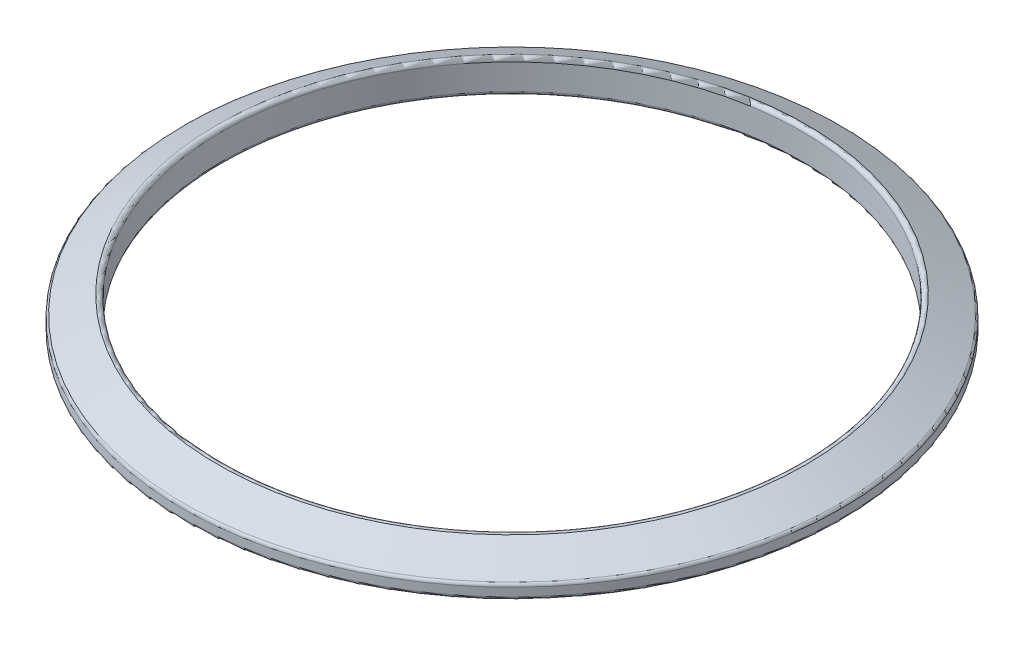
ISO-10303-21;
HEADER;
FILE_DESCRIPTION(('STEP AP214'),'2;1');
FILE_NAME('part.step','',(''),(''),'','','');
FILE_SCHEMA(('AUTOMOTIVE_DESIGN { 1 0 10303 214 1 1 1 1 }'));
ENDSEC;
DATA;
#1=APPLICATION_CONTEXT('core data for automotive mechanical design processes');
#2=APPLICATION_PROTOCOL_DEFINITION('international standard','automotive_design',2000,#1);
#3=PRODUCT_CONTEXT('',#1,'mechanical');
#4=PRODUCT('Part','Part','',(#3));
#5=PRODUCT_RELATED_PRODUCT_CATEGORY('part','',(#4));
#6=PRODUCT_DEFINITION_FORMATION('','',#4);
#7=PRODUCT_DEFINITION_CONTEXT('part definition',#1,'design');
#8=PRODUCT_DEFINITION('design','',#6,#7);
#9=PRODUCT_DEFINITION_SHAPE('','',#8);
#10=(LENGTH_UNIT() NAMED_UNIT(*) SI_UNIT(.MILLI.,.METRE.));
#11=(NAMED_UNIT(*) PLANE_ANGLE_UNIT() SI_UNIT($,.RADIAN.));
#12=(NAMED_UNIT(*) SI_UNIT($,.STERADIAN.) SOLID_ANGLE_UNIT());
#13=UNCERTAINTY_MEASURE_WITH_UNIT(LENGTH_MEASURE(1.E-05),#10,'distance_accuracy_value','');
#14=(GEOMETRIC_REPRESENTATION_CONTEXT(3) GLOBAL_UNCERTAINTY_ASSIGNED_CONTEXT((#13)) GLOBAL_UNIT_ASSIGNED_CONTEXT((#10,
#11,#12)) REPRESENTATION_CONTEXT('',''));
#15=CARTESIAN_POINT('',(0.,0.,0.));
#16=DIRECTION('',(0.,0.,1.));
#17=DIRECTION('',(1.,0.,0.));
#18=AXIS2_PLACEMENT_3D('',#15,#16,#17);
#19=CARTESIAN_POINT('',(0.,0.5,0.));
#20=DIRECTION('',(0.,1.,0.));
#21=DIRECTION('',(-0.999987705296869,0.,-0.00495875539848985));
#22=AXIS2_PLACEMENT_3D('',#19,#20,#21);
#23=TOROIDAL_SURFACE('',#22,41.75,0.5);
#24=CARTESIAN_POINT('',(0.,0.,0.));
#25=DIRECTION('',(0.,1.,0.));
#26=DIRECTION('',(-1.,0.,0.));
#27=AXIS2_PLACEMENT_3D('',#24,#25,#26);
#28=CIRCLE('',#27,41.74999998856);
#29=CARTESIAN_POINT('',(41.7494866847044,0.,0.207028037830218));
#30=VERTEX_POINT('',#29);
#31=EDGE_CURVE('E111',#30,#30,#28,.T.);
#32=ORIENTED_EDGE('',*,*,#31,.F.);
#33=CARTESIAN_POINT('',(41.7494866961443,0.5,0.207028037886946));
#34=DIRECTION('',(0.00495875539848973,0.,-0.999987705296869));
#35=DIRECTION('',(0.999987705296869,0.,0.00495875539848973));
#36=AXIS2_PLACEMENT_3D('',#33,#34,#35);
#37=CIRCLE('',#36,0.5);
#38=CARTESIAN_POINT('',(41.2494928434958,0.5,0.204548660187701));
#39=VERTEX_POINT('',#38);
#40=EDGE_CURVE('E11',#30,#39,#37,.T.);
#41=ORIENTED_EDGE('',*,*,#40,.T.);
#42=CARTESIAN_POINT('',(0.,0.5,0.));
#43=DIRECTION('',(0.,1.,0.));
#44=DIRECTION('',(1.,0.,0.));
#45=AXIS2_PLACEMENT_3D('',#42,#43,#44);
#46=CIRCLE('',#45,41.25);
#47=CARTESIAN_POINT('',(-41.25,0.5,0.));
#48=VERTEX_POINT('',#47);
#49=EDGE_CURVE('E145',#39,#48,#46,.T.);
#50=ORIENTED_EDGE('',*,*,#49,.T.);
#51=CARTESIAN_POINT('',(0.,0.5,0.));
#52=DIRECTION('',(0.,1.,0.));
#53=DIRECTION('',(1.,0.,0.));
#54=AXIS2_PLACEMENT_3D('',#51,#52,#53);
#55=CIRCLE('',#54,41.25);
#56=EDGE_CURVE('E149',#48,#39,#55,.T.);
#57=ORIENTED_EDGE('',*,*,#56,.T.);
#58=ORIENTED_EDGE('',*,*,#40,.F.);
#59=EDGE_LOOP('',(#32,#41,#50,#57,#58));
#60=FACE_BOUND('',#59,.T.);
#61=ADVANCED_FACE('F17',(#60),#23,.T.);
#62=CARTESIAN_POINT('',(0.,-0.25,0.));
#63=DIRECTION('',(0.,1.,0.));
#64=DIRECTION('',(1.,0.,0.));
#65=AXIS2_PLACEMENT_3D('',#62,#63,#64);
#66=CYLINDRICAL_SURFACE('',#65,41.25);
#67=ORIENTED_EDGE('',*,*,#49,.F.);
#68=ORIENTED_EDGE('',*,*,#56,.F.);
#69=DIRECTION('',(0.,1.,0.));
#70=VECTOR('',#69,1.);
#71=CARTESIAN_POINT('',(-41.25,-0.25,0.));
#72=LINE('',#71,#70);
#73=CARTESIAN_POINT('',(-41.25,4.175168618649,0.));
#74=VERTEX_POINT('',#73);
#75=EDGE_CURVE('E28',#48,#74,#72,.T.);
#76=ORIENTED_EDGE('',*,*,#75,.T.);
#77=CARTESIAN_POINT('',(0.,4.175168618649,0.));
#78=DIRECTION('',(0.,1.,0.));
#79=DIRECTION('',(1.,0.,0.));
#80=AXIS2_PLACEMENT_3D('',#77,#78,#79);
#81=CIRCLE('',#80,41.25);
#82=CARTESIAN_POINT('',(-41.2495567787434,4.175168618649,-0.191221225882323));
#83=VERTEX_POINT('',#82);
#84=EDGE_CURVE('E129',#74,#83,#81,.T.);
#85=ORIENTED_EDGE('',*,*,#84,.T.);
#86=CARTESIAN_POINT('',(0.,4.175168618649,0.));
#87=DIRECTION('',(0.,1.,0.));
#88=DIRECTION('',(1.,0.,0.));
#89=AXIS2_PLACEMENT_3D('',#86,#87,#88);
#90=CIRCLE('',#89,41.25);
#91=EDGE_CURVE('E126',#83,#74,#90,.T.);
#92=ORIENTED_EDGE('',*,*,#91,.T.);
#93=ORIENTED_EDGE('',*,*,#75,.F.);
#94=EDGE_LOOP('',(#67,#68,#76,#85,#92,#93));
#95=FACE_BOUND('',#94,.T.);
#96=ADVANCED_FACE('F196',(#95),#66,.F.);
#97=CARTESIAN_POINT('',(0.,4.175168618649,0.));
#98=DIRECTION('',(0.,1.,0.));
#99=DIRECTION('',(0.999989255242263,0.,0.00463566608199583));
#100=AXIS2_PLACEMENT_3D('',#97,#98,#99);
#101=TOROIDAL_SURFACE('',#100,41.75,0.5);
#102=ORIENTED_EDGE('',*,*,#84,.F.);
#103=ORIENTED_EDGE('',*,*,#91,.F.);
#104=CARTESIAN_POINT('',(-41.7495514063645,4.175168618649,-0.193539058923321));
#105=DIRECTION('',(-0.00463566608199571,0.,0.999989255242263));
#106=DIRECTION('',(-0.999989255242263,0.,-0.00463566608199571));
#107=AXIS2_PLACEMENT_3D('',#104,#105,#106);
#108=CIRCLE('',#107,0.5);
#109=CARTESIAN_POINT('',(-41.9808319697842,4.618461018172,-0.194611209906593));
#110=VERTEX_POINT('',#109);
#111=EDGE_CURVE('E21',#83,#110,#108,.T.);
#112=ORIENTED_EDGE('',*,*,#111,.T.);
#113=CARTESIAN_POINT('',(0.,4.618461018172,0.));
#114=DIRECTION('',(0.,1.,0.));
#115=DIRECTION('',(1.,0.,0.));
#116=AXIS2_PLACEMENT_3D('',#113,#114,#115);
#117=CIRCLE('',#116,41.9812830485);
#118=CARTESIAN_POINT('',(41.9812830485014,4.61846101817462,0.));
#119=VERTEX_POINT('',#118);
#120=EDGE_CURVE('E136',#110,#119,#117,.T.);
#121=ORIENTED_EDGE('',*,*,#120,.T.);
#122=CARTESIAN_POINT('',(0.,4.618461018172,0.));
#123=DIRECTION('',(0.,1.,0.));
#124=DIRECTION('',(1.,0.,0.));
#125=AXIS2_PLACEMENT_3D('',#122,#123,#124);
#126=CIRCLE('',#125,41.9812830485);
#127=EDGE_CURVE('E140',#119,#110,#126,.T.);
#128=ORIENTED_EDGE('',*,*,#127,.T.);
#129=ORIENTED_EDGE('',*,*,#111,.F.);
#130=EDGE_LOOP('',(#102,#103,#112,#121,#128,#129));
#131=FACE_BOUND('',#130,.T.);
#132=ADVANCED_FACE('F172',(#131),#101,.T.);
#133=CARTESIAN_POINT('',(0.,3.37933043513,0.));
#134=DIRECTION('',(0.,-1.,0.));
#135=DIRECTION('',(-1.,0.,0.));
#136=AXIS2_PLACEMENT_3D('',#133,#134,#135);
#137=CONICAL_SURFACE('',#136,44.35628333267,1.08990904659952);
#138=CARTESIAN_POINT('',(0.,2.140200142059,0.));
#139=DIRECTION('',(0.,1.,0.));
#140=DIRECTION('',(1.,0.,0.));
#141=AXIS2_PLACEMENT_3D('',#138,#139,#140);
#142=CIRCLE('',#141,46.73128306105);
#143=CARTESIAN_POINT('',(-46.7308404949482,2.140200142059,-0.203379368891428));
#144=VERTEX_POINT('',#143);
#145=CARTESIAN_POINT('',(46.7312830610513,2.1402001420614,0.));
#146=VERTEX_POINT('',#145);
#147=EDGE_CURVE('E125',#144,#146,#142,.T.);
#148=ORIENTED_EDGE('',*,*,#147,.T.);
#149=DIRECTION('',(-0.886584846165437,0.462566006695054,0.));
#150=VECTOR('',#149,1.);
#151=CARTESIAN_POINT('',(44.35628333267,3.37933043513,0.));
#152=LINE('',#151,#150);
#153=EDGE_CURVE('E141',#146,#119,#152,.T.);
#154=ORIENTED_EDGE('',*,*,#153,.T.);
#155=ORIENTED_EDGE('',*,*,#120,.F.);
#156=ORIENTED_EDGE('',*,*,#127,.F.);
#157=ORIENTED_EDGE('',*,*,#153,.F.);
#158=CARTESIAN_POINT('',(0.,2.140200142059,0.));
#159=DIRECTION('',(0.,1.,0.));
#160=DIRECTION('',(1.,0.,0.));
#161=AXIS2_PLACEMENT_3D('',#158,#159,#160);
#162=CIRCLE('',#161,46.73128306105);
#163=EDGE_CURVE('E135',#146,#144,#162,.T.);
#164=ORIENTED_EDGE('',*,*,#163,.T.);
#165=EDGE_LOOP('',(#148,#154,#155,#156,#157,#164));
#166=FACE_BOUND('',#165,.T.);
#167=ADVANCED_FACE('F175',(#166),#137,.T.);
#168=CARTESIAN_POINT('',(0.,1.696907749084,0.));
#169=DIRECTION('',(0.,1.,0.));
#170=DIRECTION('',(0.999990529553806,0.,0.00435210325010203));
#171=AXIS2_PLACEMENT_3D('',#168,#169,#170);
#172=TOROIDAL_SURFACE('',#171,46.5,0.5);
#173=ORIENTED_EDGE('',*,*,#147,.F.);
#174=CARTESIAN_POINT('',(-46.499559624252,1.696907749084,-0.202372801129738));
#175=DIRECTION('',(-0.0043521032501019,0.,0.999990529553806));
#176=DIRECTION('',(-0.999990529553806,0.,-0.0043521032501019));
#177=AXIS2_PLACEMENT_3D('',#174,#175,#176);
#178=CIRCLE('',#177,0.5);
#179=CARTESIAN_POINT('',(-46.9995548890289,1.696907749118,-0.204548852754789));
#180=VERTEX_POINT('',#179);
#181=EDGE_CURVE('E132',#144,#180,#178,.T.);
#182=ORIENTED_EDGE('',*,*,#181,.T.);
#183=CARTESIAN_POINT('',(0.,1.696907749118,0.));
#184=DIRECTION('',(0.,1.,0.));
#185=DIRECTION('',(1.,0.,0.));
#186=AXIS2_PLACEMENT_3D('',#183,#184,#185);
#187=CIRCLE('',#186,47.);
#188=CARTESIAN_POINT('',(-47.,1.696907749118,0.));
#189=VERTEX_POINT('',#188);
#190=EDGE_CURVE('E99',#180,#189,#187,.T.);
#191=ORIENTED_EDGE('',*,*,#190,.T.);
#192=CARTESIAN_POINT('',(0.,1.696907749118,0.));
#193=DIRECTION('',(0.,1.,0.));
#194=DIRECTION('',(1.,0.,0.));
#195=AXIS2_PLACEMENT_3D('',#192,#193,#194);
#196=CIRCLE('',#195,47.);
#197=EDGE_CURVE('E97',#189,#180,#196,.T.);
#198=ORIENTED_EDGE('',*,*,#197,.T.);
#199=ORIENTED_EDGE('',*,*,#181,.F.);
#200=ORIENTED_EDGE('',*,*,#163,.F.);
#201=EDGE_LOOP('',(#173,#182,#191,#198,#199,#200));
#202=FACE_BOUND('',#201,.T.);
#203=ADVANCED_FACE('F19',(#202),#172,.T.);
#204=CARTESIAN_POINT('',(0.,-0.25,0.));
#205=DIRECTION('',(0.,1.,0.));
#206=DIRECTION('',(1.,0.,0.));
#207=AXIS2_PLACEMENT_3D('',#204,#205,#206);
#208=CYLINDRICAL_SURFACE('',#207,47.);
#209=ORIENTED_EDGE('',*,*,#197,.F.);
#210=DIRECTION('',(0.,-1.,0.));
#211=VECTOR('',#210,1.);
#212=CARTESIAN_POINT('',(-47.,-0.25,0.));
#213=LINE('',#212,#211);
#214=CARTESIAN_POINT('',(-47.,0.5,0.));
#215=VERTEX_POINT('',#214);
#216=EDGE_CURVE('E90',#189,#215,#213,.T.);
#217=ORIENTED_EDGE('',*,*,#216,.T.);
#218=CARTESIAN_POINT('',(0.,0.5,0.));
#219=DIRECTION('',(0.,1.,0.));
#220=DIRECTION('',(1.,0.,0.));
#221=AXIS2_PLACEMENT_3D('',#218,#219,#220);
#222=CIRCLE('',#221,47.);
#223=CARTESIAN_POINT('',(-46.9995109197132,0.5,-0.214413870252865));
#224=VERTEX_POINT('',#223);
#225=EDGE_CURVE('E94',#215,#224,#222,.T.);
#226=ORIENTED_EDGE('',*,*,#225,.T.);
#227=CARTESIAN_POINT('',(0.,0.5,0.));
#228=DIRECTION('',(0.,1.,0.));
#229=DIRECTION('',(1.,0.,0.));
#230=AXIS2_PLACEMENT_3D('',#227,#228,#229);
#231=CIRCLE('',#230,47.);
#232=EDGE_CURVE('E102',#224,#215,#231,.T.);
#233=ORIENTED_EDGE('',*,*,#232,.T.);
#234=ORIENTED_EDGE('',*,*,#216,.F.);
#235=ORIENTED_EDGE('',*,*,#190,.F.);
#236=EDGE_LOOP('',(#209,#217,#226,#233,#234,#235));
#237=FACE_BOUND('',#236,.T.);
#238=ADVANCED_FACE('F92',(#237),#208,.T.);
#239=CARTESIAN_POINT('',(0.,0.5,0.));
#240=DIRECTION('',(0.,1.,0.));
#241=DIRECTION('',(0.999989594036452,0.,0.00456199723942278));
#242=AXIS2_PLACEMENT_3D('',#239,#240,#241);
#243=TOROIDAL_SURFACE('',#242,46.5,0.5);
#244=ORIENTED_EDGE('',*,*,#225,.F.);
#245=ORIENTED_EDGE('',*,*,#232,.F.);
#246=CARTESIAN_POINT('',(-46.499516122695,0.5,-0.212132871633154));
#247=DIRECTION('',(-0.00456199723942266,0.,0.999989594036452));
#248=DIRECTION('',(-0.999989594036452,0.,-0.00456199723942266));
#249=AXIS2_PLACEMENT_3D('',#246,#247,#248);
#250=CIRCLE('',#249,0.5);
#251=CARTESIAN_POINT('',(-46.4995162053141,0.,-0.212132872010066));
#252=VERTEX_POINT('',#251);
#253=EDGE_CURVE('E106',#224,#252,#250,.T.);
#254=ORIENTED_EDGE('',*,*,#253,.T.);
#255=CARTESIAN_POINT('',(0.,0.,0.));
#256=DIRECTION('',(0.,1.,0.));
#257=DIRECTION('',(1.,0.,0.));
#258=AXIS2_PLACEMENT_3D('',#255,#256,#257);
#259=CIRCLE('',#258,46.50000008262);
#260=EDGE_CURVE('E118',#252,#252,#259,.T.);
#261=ORIENTED_EDGE('',*,*,#260,.T.);
#262=ORIENTED_EDGE('',*,*,#253,.F.);
#263=EDGE_LOOP('',(#244,#245,#254,#261,#262));
#264=FACE_BOUND('',#263,.T.);
#265=ADVANCED_FACE('F108',(#264),#243,.T.);
#266=CARTESIAN_POINT('',(0.,0.,0.));
#267=DIRECTION('',(0.,1.,0.));
#268=DIRECTION('',(1.,0.,0.));
#269=AXIS2_PLACEMENT_3D('',#266,#267,#268);
#270=PLANE('',#269);
#271=ORIENTED_EDGE('',*,*,#31,.T.);
#272=EDGE_LOOP('',(#271));
#273=FACE_BOUND('',#272,.T.);
#274=ORIENTED_EDGE('',*,*,#260,.F.);
#275=EDGE_LOOP('',(#274));
#276=FACE_BOUND('',#275,.T.);
#277=ADVANCED_FACE('F200',(#273,#276),#270,.F.);
#278=CLOSED_SHELL('',(#61,#96,#132,#167,#203,#238,#265,#277));
#279=MANIFOLD_SOLID_BREP('B1',#278);
#280=ADVANCED_BREP_SHAPE_REPRESENTATION('',(#18,#279),#14);
#281=SHAPE_DEFINITION_REPRESENTATION(#9,#280);
ENDSEC;
END-ISO-10303-21;
